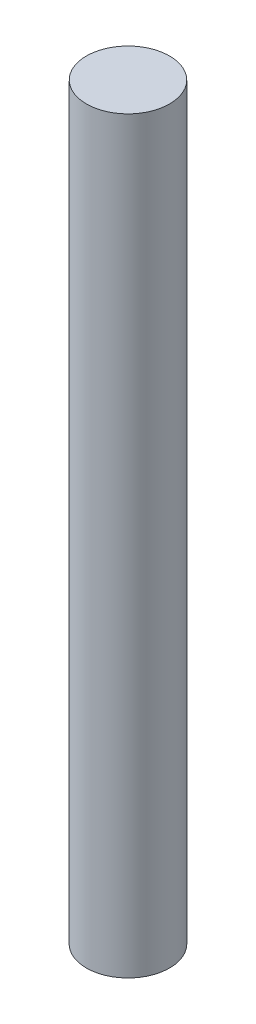
ISO-10303-21;
HEADER;
FILE_DESCRIPTION(('STEP AP214'),'2;1');
FILE_NAME('part.step','',(''),(''),'','','');
FILE_SCHEMA(('AUTOMOTIVE_DESIGN { 1 0 10303 214 1 1 1 1 }'));
ENDSEC;
DATA;
#1=APPLICATION_CONTEXT('core data for automotive mechanical design processes');
#2=APPLICATION_PROTOCOL_DEFINITION('international standard','automotive_design',2000,#1);
#3=PRODUCT_CONTEXT('',#1,'mechanical');
#4=PRODUCT('Part','Part','',(#3));
#5=PRODUCT_RELATED_PRODUCT_CATEGORY('part','',(#4));
#6=PRODUCT_DEFINITION_FORMATION('','',#4);
#7=PRODUCT_DEFINITION_CONTEXT('part definition',#1,'design');
#8=PRODUCT_DEFINITION('design','',#6,#7);
#9=PRODUCT_DEFINITION_SHAPE('','',#8);
#10=(LENGTH_UNIT() NAMED_UNIT(*) SI_UNIT(.MILLI.,.METRE.));
#11=(NAMED_UNIT(*) PLANE_ANGLE_UNIT() SI_UNIT($,.RADIAN.));
#12=(NAMED_UNIT(*) SI_UNIT($,.STERADIAN.) SOLID_ANGLE_UNIT());
#13=UNCERTAINTY_MEASURE_WITH_UNIT(LENGTH_MEASURE(1.E-05),#10,'distance_accuracy_value','');
#14=(GEOMETRIC_REPRESENTATION_CONTEXT(3) GLOBAL_UNCERTAINTY_ASSIGNED_CONTEXT((#13)) GLOBAL_UNIT_ASSIGNED_CONTEXT((#10,
#11,#12)) REPRESENTATION_CONTEXT('',''));
#15=CARTESIAN_POINT('',(0.,0.,0.));
#16=DIRECTION('',(0.,0.,1.));
#17=DIRECTION('',(1.,0.,0.));
#18=AXIS2_PLACEMENT_3D('',#15,#16,#17);
#19=CARTESIAN_POINT('',(0.,22.8600000000001,0.));
#20=DIRECTION('',(0.,-1.,0.));
#21=DIRECTION('',(0.,0.,-1.));
#22=AXIS2_PLACEMENT_3D('',#19,#20,#21);
#23=CYLINDRICAL_SURFACE('',#22,1.27);
#24=CARTESIAN_POINT('',(0.,22.8600000000001,0.));
#25=DIRECTION('',(0.,1.,0.));
#26=DIRECTION('',(0.,0.,1.));
#27=AXIS2_PLACEMENT_3D('',#24,#25,#26);
#28=CIRCLE('',#27,1.27);
#29=CARTESIAN_POINT('',(0.,22.8600000000001,1.27));
#30=VERTEX_POINT('',#29);
#31=EDGE_CURVE('E12',#30,#30,#28,.T.);
#32=ORIENTED_EDGE('',*,*,#31,.F.);
#33=EDGE_LOOP('',(#32));
#34=FACE_BOUND('',#33,.T.);
#35=CARTESIAN_POINT('',(0.,0.,0.));
#36=DIRECTION('',(0.,1.,0.));
#37=DIRECTION('',(0.,0.,1.));
#38=AXIS2_PLACEMENT_3D('',#35,#36,#37);
#39=CIRCLE('',#38,1.27);
#40=CARTESIAN_POINT('',(0.,0.,1.27));
#41=VERTEX_POINT('',#40);
#42=EDGE_CURVE('E52',#41,#41,#39,.T.);
#43=ORIENTED_EDGE('',*,*,#42,.T.);
#44=EDGE_LOOP('',(#43));
#45=FACE_BOUND('',#44,.T.);
#46=ADVANCED_FACE('F49',(#34,#45),#23,.T.);
#47=CARTESIAN_POINT('',(0.,22.8600000000001,0.));
#48=DIRECTION('',(0.,1.,0.));
#49=DIRECTION('',(0.,0.,1.));
#50=AXIS2_PLACEMENT_3D('',#47,#48,#49);
#51=PLANE('',#50);
#52=ORIENTED_EDGE('',*,*,#31,.T.);
#53=EDGE_LOOP('',(#52));
#54=FACE_BOUND('',#53,.T.);
#55=ADVANCED_FACE('F64',(#54),#51,.T.);
#56=CARTESIAN_POINT('',(0.,0.,0.));
#57=DIRECTION('',(0.,1.,0.));
#58=DIRECTION('',(0.,0.,1.));
#59=AXIS2_PLACEMENT_3D('',#56,#57,#58);
#60=PLANE('',#59);
#61=ORIENTED_EDGE('',*,*,#42,.F.);
#62=EDGE_LOOP('',(#61));
#63=FACE_BOUND('',#62,.T.);
#64=ADVANCED_FACE('F62',(#63),#60,.F.);
#65=CLOSED_SHELL('',(#46,#55,#64));
#66=MANIFOLD_SOLID_BREP('B2',#65);
#67=ADVANCED_BREP_SHAPE_REPRESENTATION('',(#18,#66),#14);
#68=SHAPE_DEFINITION_REPRESENTATION(#9,#67);
ENDSEC;
END-ISO-10303-21;
